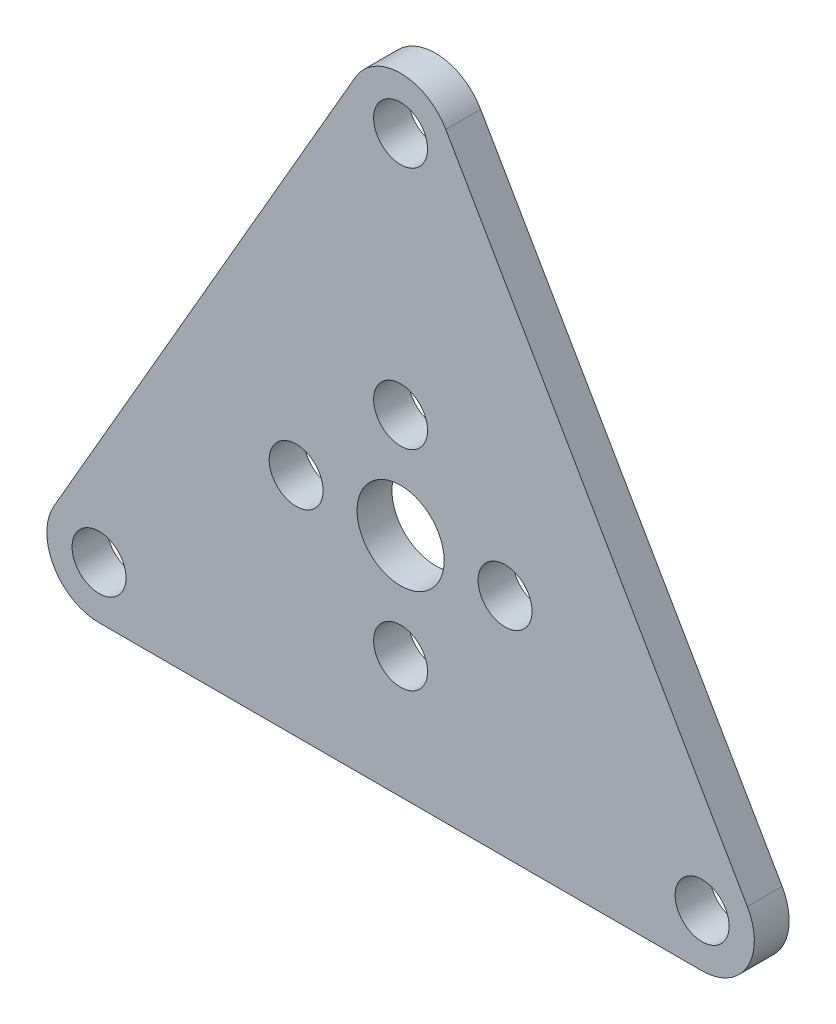
ISO-10303-21;
HEADER;
FILE_DESCRIPTION(('STEP AP214'),'2;1');
FILE_NAME('part.step','',(''),(''),'','','');
FILE_SCHEMA(('AUTOMOTIVE_DESIGN { 1 0 10303 214 1 1 1 1 }'));
ENDSEC;
DATA;
#1=APPLICATION_CONTEXT('core data for automotive mechanical design processes');
#2=APPLICATION_PROTOCOL_DEFINITION('international standard','automotive_design',2000,#1);
#3=PRODUCT_CONTEXT('',#1,'mechanical');
#4=PRODUCT('Part','Part','',(#3));
#5=PRODUCT_RELATED_PRODUCT_CATEGORY('part','',(#4));
#6=PRODUCT_DEFINITION_FORMATION('','',#4);
#7=PRODUCT_DEFINITION_CONTEXT('part definition',#1,'design');
#8=PRODUCT_DEFINITION('design','',#6,#7);
#9=PRODUCT_DEFINITION_SHAPE('','',#8);
#10=(LENGTH_UNIT() NAMED_UNIT(*) SI_UNIT(.MILLI.,.METRE.));
#11=(NAMED_UNIT(*) PLANE_ANGLE_UNIT() SI_UNIT($,.RADIAN.));
#12=(NAMED_UNIT(*) SI_UNIT($,.STERADIAN.) SOLID_ANGLE_UNIT());
#13=UNCERTAINTY_MEASURE_WITH_UNIT(LENGTH_MEASURE(1.E-05),#10,'distance_accuracy_value','');
#14=(GEOMETRIC_REPRESENTATION_CONTEXT(3) GLOBAL_UNCERTAINTY_ASSIGNED_CONTEXT((#13)) GLOBAL_UNIT_ASSIGNED_CONTEXT((#10,
#11,#12)) REPRESENTATION_CONTEXT('',''));
#15=CARTESIAN_POINT('',(0.,0.,0.));
#16=DIRECTION('',(0.,0.,1.));
#17=DIRECTION('',(1.,0.,0.));
#18=AXIS2_PLACEMENT_3D('',#15,#16,#17);
#19=CARTESIAN_POINT('',(-17.3205080756914,-9.99999999999542,2.));
#20=DIRECTION('',(0.,0.,1.));
#21=DIRECTION('',(1.,0.,0.));
#22=AXIS2_PLACEMENT_3D('',#19,#20,#21);
#23=PLANE('',#22);
#24=CARTESIAN_POINT('',(0.,0.,2.));
#25=DIRECTION('',(0.,0.,1.));
#26=DIRECTION('',(1.,0.,0.));
#27=AXIS2_PLACEMENT_3D('',#24,#25,#26);
#28=CIRCLE('',#27,2.5);
#29=CARTESIAN_POINT('',(2.5,0.,2.));
#30=VERTEX_POINT('',#29);
#31=EDGE_CURVE('E239',#30,#30,#28,.T.);
#32=ORIENTED_EDGE('',*,*,#31,.F.);
#33=EDGE_LOOP('',(#32));
#34=FACE_BOUND('',#33,.T.);
#35=CARTESIAN_POINT('',(0.,6.,2.));
#36=DIRECTION('',(0.,0.,1.));
#37=DIRECTION('',(1.,0.,0.));
#38=AXIS2_PLACEMENT_3D('',#35,#36,#37);
#39=CIRCLE('',#38,1.55);
#40=CARTESIAN_POINT('',(1.55,6.,2.));
#41=VERTEX_POINT('',#40);
#42=EDGE_CURVE('E144',#41,#41,#39,.T.);
#43=ORIENTED_EDGE('',*,*,#42,.F.);
#44=EDGE_LOOP('',(#43));
#45=FACE_BOUND('',#44,.T.);
#46=CARTESIAN_POINT('',(6.,0.,2.));
#47=DIRECTION('',(0.,0.,1.));
#48=DIRECTION('',(1.,0.,0.));
#49=AXIS2_PLACEMENT_3D('',#46,#47,#48);
#50=CIRCLE('',#49,1.55);
#51=CARTESIAN_POINT('',(7.55,0.,2.));
#52=VERTEX_POINT('',#51);
#53=EDGE_CURVE('E249',#52,#52,#50,.T.);
#54=ORIENTED_EDGE('',*,*,#53,.F.);
#55=EDGE_LOOP('',(#54));
#56=FACE_BOUND('',#55,.T.);
#57=CARTESIAN_POINT('',(0.,-6.,2.));
#58=DIRECTION('',(0.,0.,1.));
#59=DIRECTION('',(1.,0.,0.));
#60=AXIS2_PLACEMENT_3D('',#57,#58,#59);
#61=CIRCLE('',#60,1.55);
#62=CARTESIAN_POINT('',(1.55,-6.,2.));
#63=VERTEX_POINT('',#62);
#64=EDGE_CURVE('E244',#63,#63,#61,.T.);
#65=ORIENTED_EDGE('',*,*,#64,.F.);
#66=EDGE_LOOP('',(#65));
#67=FACE_BOUND('',#66,.T.);
#68=CARTESIAN_POINT('',(-6.,0.,2.));
#69=DIRECTION('',(0.,0.,1.));
#70=DIRECTION('',(1.,0.,0.));
#71=AXIS2_PLACEMENT_3D('',#68,#69,#70);
#72=CIRCLE('',#71,1.55);
#73=CARTESIAN_POINT('',(-4.45,0.,2.));
#74=VERTEX_POINT('',#73);
#75=EDGE_CURVE('E242',#74,#74,#72,.T.);
#76=ORIENTED_EDGE('',*,*,#75,.F.);
#77=EDGE_LOOP('',(#76));
#78=FACE_BOUND('',#77,.T.);
#79=CARTESIAN_POINT('',(17.3205080756874,-10.0000000000023,2.));
#80=DIRECTION('',(0.,0.,1.));
#81=DIRECTION('',(1.,0.,0.));
#82=AXIS2_PLACEMENT_3D('',#79,#80,#81);
#83=CIRCLE('',#82,1.55);
#84=CARTESIAN_POINT('',(18.8705080756874,-10.0000000000023,2.));
#85=VERTEX_POINT('',#84);
#86=EDGE_CURVE('E164',#85,#85,#83,.T.);
#87=ORIENTED_EDGE('',*,*,#86,.F.);
#88=EDGE_LOOP('',(#87));
#89=FACE_BOUND('',#88,.T.);
#90=CARTESIAN_POINT('',(-17.3205080756914,-9.99999999999542,2.));
#91=DIRECTION('',(0.,0.,1.));
#92=DIRECTION('',(1.,0.,0.));
#93=AXIS2_PLACEMENT_3D('',#90,#91,#92);
#94=CIRCLE('',#93,3.);
#95=CARTESIAN_POINT('',(-19.9185842870445,-8.49999999999508,2.));
#96=VERTEX_POINT('',#95);
#97=CARTESIAN_POINT('',(-17.3205080756914,-12.9999999999954,2.));
#98=VERTEX_POINT('',#97);
#99=EDGE_CURVE('E134',#96,#98,#94,.T.);
#100=ORIENTED_EDGE('',*,*,#99,.T.);
#101=DIRECTION('',(1.,-1.98105218420136E-13,0.));
#102=VECTOR('',#101,1.);
#103=CARTESIAN_POINT('',(-17.3205080756914,-12.9999999999954,2.));
#104=LINE('',#103,#102);
#105=CARTESIAN_POINT('',(17.3205080756869,-13.0000000000023,2.));
#106=VERTEX_POINT('',#105);
#107=EDGE_CURVE('E92',#98,#106,#104,.T.);
#108=ORIENTED_EDGE('',*,*,#107,.T.);
#109=CARTESIAN_POINT('',(17.3205080756874,-10.0000000000023,2.));
#110=DIRECTION('',(0.,0.,1.));
#111=DIRECTION('',(1.,0.,0.));
#112=AXIS2_PLACEMENT_3D('',#109,#110,#111);
#113=CIRCLE('',#112,3.);
#114=CARTESIAN_POINT('',(19.9185842870409,-8.50000000000246,2.));
#115=VERTEX_POINT('',#114);
#116=EDGE_CURVE('E105',#106,#115,#113,.T.);
#117=ORIENTED_EDGE('',*,*,#116,.T.);
#118=DIRECTION('',(-0.499999999999943,0.866025403784472,0.));
#119=VECTOR('',#118,1.);
#120=CARTESIAN_POINT('',(2.59807621135341,21.4999999999998,2.));
#121=LINE('',#120,#119);
#122=CARTESIAN_POINT('',(2.59807621135341,21.4999999999998,2.));
#123=VERTEX_POINT('',#122);
#124=EDGE_CURVE('E99',#115,#123,#121,.T.);
#125=ORIENTED_EDGE('',*,*,#124,.T.);
#126=CARTESIAN_POINT('',(0.,20.,2.));
#127=DIRECTION('',(0.,0.,1.));
#128=DIRECTION('',(1.,0.,0.));
#129=AXIS2_PLACEMENT_3D('',#126,#127,#128);
#130=CIRCLE('',#129,3.);
#131=CARTESIAN_POINT('',(-2.59807621135312,21.5000000000003,2.));
#132=VERTEX_POINT('',#131);
#133=EDGE_CURVE('E103',#123,#132,#130,.T.);
#134=ORIENTED_EDGE('',*,*,#133,.T.);
#135=DIRECTION('',(-0.500000000000114,-0.866025403784372,0.));
#136=VECTOR('',#135,1.);
#137=CARTESIAN_POINT('',(-2.59807621135312,21.5000000000003,2.));
#138=LINE('',#137,#136);
#139=EDGE_CURVE('E55',#132,#96,#138,.T.);
#140=ORIENTED_EDGE('',*,*,#139,.T.);
#141=EDGE_LOOP('',(#100,#108,#117,#125,#134,#140));
#142=FACE_BOUND('',#141,.T.);
#143=CARTESIAN_POINT('',(0.,20.,2.));
#144=DIRECTION('',(0.,0.,1.));
#145=DIRECTION('',(1.,0.,0.));
#146=AXIS2_PLACEMENT_3D('',#143,#144,#145);
#147=CIRCLE('',#146,1.55);
#148=CARTESIAN_POINT('',(1.55,20.,2.));
#149=VERTEX_POINT('',#148);
#150=EDGE_CURVE('E127',#149,#149,#147,.T.);
#151=ORIENTED_EDGE('',*,*,#150,.F.);
#152=EDGE_LOOP('',(#151));
#153=FACE_BOUND('',#152,.T.);
#154=CARTESIAN_POINT('',(-17.3205080756914,-9.99999999999542,2.));
#155=DIRECTION('',(0.,0.,1.));
#156=DIRECTION('',(1.,0.,0.));
#157=AXIS2_PLACEMENT_3D('',#154,#155,#156);
#158=CIRCLE('',#157,1.55);
#159=CARTESIAN_POINT('',(-15.7705080756914,-9.99999999999542,2.));
#160=VERTEX_POINT('',#159);
#161=EDGE_CURVE('E155',#160,#160,#158,.T.);
#162=ORIENTED_EDGE('',*,*,#161,.F.);
#163=EDGE_LOOP('',(#162));
#164=FACE_BOUND('',#163,.T.);
#165=ADVANCED_FACE('F36',(#34,#45,#56,#67,#78,#89,#142,#153,#164),#23,.T.);
#166=CARTESIAN_POINT('',(-17.3205080756914,-9.99999999999542,0.));
#167=DIRECTION('',(0.,0.,1.));
#168=DIRECTION('',(1.,0.,0.));
#169=AXIS2_PLACEMENT_3D('',#166,#167,#168);
#170=PLANE('',#169);
#171=CARTESIAN_POINT('',(0.,0.,0.));
#172=DIRECTION('',(0.,0.,1.));
#173=DIRECTION('',(1.,0.,0.));
#174=AXIS2_PLACEMENT_3D('',#171,#172,#173);
#175=CIRCLE('',#174,2.5);
#176=CARTESIAN_POINT('',(2.5,0.,0.));
#177=VERTEX_POINT('',#176);
#178=EDGE_CURVE('E40',#177,#177,#175,.T.);
#179=ORIENTED_EDGE('',*,*,#178,.T.);
#180=EDGE_LOOP('',(#179));
#181=FACE_BOUND('',#180,.T.);
#182=CARTESIAN_POINT('',(0.,6.,0.));
#183=DIRECTION('',(0.,0.,1.));
#184=DIRECTION('',(1.,0.,0.));
#185=AXIS2_PLACEMENT_3D('',#182,#183,#184);
#186=CIRCLE('',#185,1.55);
#187=CARTESIAN_POINT('',(1.55,6.,0.));
#188=VERTEX_POINT('',#187);
#189=EDGE_CURVE('E149',#188,#188,#186,.T.);
#190=ORIENTED_EDGE('',*,*,#189,.T.);
#191=EDGE_LOOP('',(#190));
#192=FACE_BOUND('',#191,.T.);
#193=CARTESIAN_POINT('',(6.,0.,0.));
#194=DIRECTION('',(0.,0.,1.));
#195=DIRECTION('',(1.,0.,0.));
#196=AXIS2_PLACEMENT_3D('',#193,#194,#195);
#197=CIRCLE('',#196,1.55);
#198=CARTESIAN_POINT('',(7.55,0.,0.));
#199=VERTEX_POINT('',#198);
#200=EDGE_CURVE('E147',#199,#199,#197,.T.);
#201=ORIENTED_EDGE('',*,*,#200,.T.);
#202=EDGE_LOOP('',(#201));
#203=FACE_BOUND('',#202,.T.);
#204=CARTESIAN_POINT('',(0.,-6.,0.));
#205=DIRECTION('',(0.,0.,1.));
#206=DIRECTION('',(1.,0.,0.));
#207=AXIS2_PLACEMENT_3D('',#204,#205,#206);
#208=CIRCLE('',#207,1.55);
#209=CARTESIAN_POINT('',(1.55,-6.,0.));
#210=VERTEX_POINT('',#209);
#211=EDGE_CURVE('E143',#210,#210,#208,.T.);
#212=ORIENTED_EDGE('',*,*,#211,.T.);
#213=EDGE_LOOP('',(#212));
#214=FACE_BOUND('',#213,.T.);
#215=CARTESIAN_POINT('',(-6.,0.,0.));
#216=DIRECTION('',(0.,0.,1.));
#217=DIRECTION('',(1.,0.,0.));
#218=AXIS2_PLACEMENT_3D('',#215,#216,#217);
#219=CIRCLE('',#218,1.55);
#220=CARTESIAN_POINT('',(-4.45,0.,0.));
#221=VERTEX_POINT('',#220);
#222=EDGE_CURVE('E140',#221,#221,#219,.T.);
#223=ORIENTED_EDGE('',*,*,#222,.T.);
#224=EDGE_LOOP('',(#223));
#225=FACE_BOUND('',#224,.T.);
#226=CARTESIAN_POINT('',(-17.3205080756914,-9.99999999999542,0.));
#227=DIRECTION('',(0.,0.,1.));
#228=DIRECTION('',(1.,0.,0.));
#229=AXIS2_PLACEMENT_3D('',#226,#227,#228);
#230=CIRCLE('',#229,3.);
#231=CARTESIAN_POINT('',(-19.9185842870445,-8.49999999999508,0.));
#232=VERTEX_POINT('',#231);
#233=CARTESIAN_POINT('',(-17.3205080756914,-12.9999999999954,0.));
#234=VERTEX_POINT('',#233);
#235=EDGE_CURVE('E123',#232,#234,#230,.T.);
#236=ORIENTED_EDGE('',*,*,#235,.F.);
#237=DIRECTION('',(-0.500000000000114,-0.866025403784372,0.));
#238=VECTOR('',#237,1.);
#239=CARTESIAN_POINT('',(-2.59807621135312,21.5000000000003,0.));
#240=LINE('',#239,#238);
#241=CARTESIAN_POINT('',(-2.59807621135312,21.5000000000003,0.));
#242=VERTEX_POINT('',#241);
#243=EDGE_CURVE('E84',#242,#232,#240,.T.);
#244=ORIENTED_EDGE('',*,*,#243,.F.);
#245=CARTESIAN_POINT('',(0.,20.,0.));
#246=DIRECTION('',(0.,0.,1.));
#247=DIRECTION('',(1.,0.,0.));
#248=AXIS2_PLACEMENT_3D('',#245,#246,#247);
#249=CIRCLE('',#248,3.);
#250=CARTESIAN_POINT('',(2.59807621135341,21.4999999999998,0.));
#251=VERTEX_POINT('',#250);
#252=EDGE_CURVE('E78',#251,#242,#249,.T.);
#253=ORIENTED_EDGE('',*,*,#252,.F.);
#254=DIRECTION('',(-0.499999999999943,0.866025403784472,0.));
#255=VECTOR('',#254,1.);
#256=CARTESIAN_POINT('',(2.59807621135341,21.4999999999998,0.));
#257=LINE('',#256,#255);
#258=CARTESIAN_POINT('',(19.9185842870409,-8.50000000000246,0.));
#259=VERTEX_POINT('',#258);
#260=EDGE_CURVE('E113',#259,#251,#257,.T.);
#261=ORIENTED_EDGE('',*,*,#260,.F.);
#262=CARTESIAN_POINT('',(17.3205080756874,-10.0000000000023,0.));
#263=DIRECTION('',(0.,0.,1.));
#264=DIRECTION('',(1.,0.,0.));
#265=AXIS2_PLACEMENT_3D('',#262,#263,#264);
#266=CIRCLE('',#265,3.);
#267=CARTESIAN_POINT('',(17.3205080756869,-13.0000000000023,0.));
#268=VERTEX_POINT('',#267);
#269=EDGE_CURVE('E129',#268,#259,#266,.T.);
#270=ORIENTED_EDGE('',*,*,#269,.F.);
#271=DIRECTION('',(1.,-1.98105218420136E-13,0.));
#272=VECTOR('',#271,1.);
#273=CARTESIAN_POINT('',(-17.3205080756914,-12.9999999999954,0.));
#274=LINE('',#273,#272);
#275=EDGE_CURVE('E126',#234,#268,#274,.T.);
#276=ORIENTED_EDGE('',*,*,#275,.F.);
#277=EDGE_LOOP('',(#236,#244,#253,#261,#270,#276));
#278=FACE_BOUND('',#277,.T.);
#279=CARTESIAN_POINT('',(0.,20.,0.));
#280=DIRECTION('',(0.,0.,1.));
#281=DIRECTION('',(1.,0.,0.));
#282=AXIS2_PLACEMENT_3D('',#279,#280,#281);
#283=CIRCLE('',#282,1.55);
#284=CARTESIAN_POINT('',(1.55,20.,0.));
#285=VERTEX_POINT('',#284);
#286=EDGE_CURVE('E167',#285,#285,#283,.T.);
#287=ORIENTED_EDGE('',*,*,#286,.T.);
#288=EDGE_LOOP('',(#287));
#289=FACE_BOUND('',#288,.T.);
#290=CARTESIAN_POINT('',(17.3205080756874,-10.0000000000023,0.));
#291=DIRECTION('',(0.,0.,1.));
#292=DIRECTION('',(1.,0.,0.));
#293=AXIS2_PLACEMENT_3D('',#290,#291,#292);
#294=CIRCLE('',#293,1.55);
#295=CARTESIAN_POINT('',(18.8705080756874,-10.0000000000023,0.));
#296=VERTEX_POINT('',#295);
#297=EDGE_CURVE('E160',#296,#296,#294,.T.);
#298=ORIENTED_EDGE('',*,*,#297,.T.);
#299=EDGE_LOOP('',(#298));
#300=FACE_BOUND('',#299,.T.);
#301=CARTESIAN_POINT('',(-17.3205080756914,-9.99999999999542,0.));
#302=DIRECTION('',(0.,0.,1.));
#303=DIRECTION('',(1.,0.,0.));
#304=AXIS2_PLACEMENT_3D('',#301,#302,#303);
#305=CIRCLE('',#304,1.55);
#306=CARTESIAN_POINT('',(-15.7705080756914,-9.99999999999542,0.));
#307=VERTEX_POINT('',#306);
#308=EDGE_CURVE('E151',#307,#307,#305,.T.);
#309=ORIENTED_EDGE('',*,*,#308,.T.);
#310=EDGE_LOOP('',(#309));
#311=FACE_BOUND('',#310,.T.);
#312=ADVANCED_FACE('F183',(#181,#192,#203,#214,#225,#278,#289,#300,#311),#170,.F.);
#313=CARTESIAN_POINT('',(-17.3205080756914,-9.99999999999542,2.));
#314=DIRECTION('',(0.,0.,-1.));
#315=DIRECTION('',(-1.,0.,0.));
#316=AXIS2_PLACEMENT_3D('',#313,#314,#315);
#317=CYLINDRICAL_SURFACE('',#316,3.);
#318=ORIENTED_EDGE('',*,*,#235,.T.);
#319=DIRECTION('',(0.,0.,-1.));
#320=VECTOR('',#319,1.);
#321=CARTESIAN_POINT('',(-17.3205080756914,-12.9999999999954,2.));
#322=LINE('',#321,#320);
#323=EDGE_CURVE('E11',#98,#234,#322,.T.);
#324=ORIENTED_EDGE('',*,*,#323,.F.);
#325=ORIENTED_EDGE('',*,*,#99,.F.);
#326=DIRECTION('',(0.,0.,-1.));
#327=VECTOR('',#326,1.);
#328=CARTESIAN_POINT('',(-19.9185842870445,-8.49999999999508,2.));
#329=LINE('',#328,#327);
#330=EDGE_CURVE('E119',#96,#232,#329,.T.);
#331=ORIENTED_EDGE('',*,*,#330,.T.);
#332=EDGE_LOOP('',(#318,#324,#325,#331));
#333=FACE_BOUND('',#332,.T.);
#334=ADVANCED_FACE('F38',(#333),#317,.T.);
#335=CARTESIAN_POINT('',(-17.3205080756914,-12.9999999999954,2.));
#336=DIRECTION('',(1.98105218420136E-13,1.,0.));
#337=DIRECTION('',(-1.,1.98105218420136E-13,0.));
#338=AXIS2_PLACEMENT_3D('',#335,#336,#337);
#339=PLANE('',#338);
#340=ORIENTED_EDGE('',*,*,#275,.T.);
#341=DIRECTION('',(0.,0.,-1.));
#342=VECTOR('',#341,1.);
#343=CARTESIAN_POINT('',(17.3205080756869,-13.0000000000023,2.));
#344=LINE('',#343,#342);
#345=EDGE_CURVE('E46',#106,#268,#344,.T.);
#346=ORIENTED_EDGE('',*,*,#345,.F.);
#347=ORIENTED_EDGE('',*,*,#107,.F.);
#348=ORIENTED_EDGE('',*,*,#323,.T.);
#349=EDGE_LOOP('',(#340,#346,#347,#348));
#350=FACE_BOUND('',#349,.T.);
#351=ADVANCED_FACE('F177',(#350),#339,.F.);
#352=CARTESIAN_POINT('',(17.3205080756874,-10.0000000000023,2.));
#353=DIRECTION('',(0.,0.,-1.));
#354=DIRECTION('',(-1.,0.,0.));
#355=AXIS2_PLACEMENT_3D('',#352,#353,#354);
#356=CYLINDRICAL_SURFACE('',#355,3.);
#357=ORIENTED_EDGE('',*,*,#269,.T.);
#358=DIRECTION('',(0.,0.,-1.));
#359=VECTOR('',#358,1.);
#360=CARTESIAN_POINT('',(19.9185842870409,-8.50000000000246,2.));
#361=LINE('',#360,#359);
#362=EDGE_CURVE('E114',#115,#259,#361,.T.);
#363=ORIENTED_EDGE('',*,*,#362,.F.);
#364=ORIENTED_EDGE('',*,*,#116,.F.);
#365=ORIENTED_EDGE('',*,*,#345,.T.);
#366=EDGE_LOOP('',(#357,#363,#364,#365));
#367=FACE_BOUND('',#366,.T.);
#368=ADVANCED_FACE('F180',(#367),#356,.T.);
#369=CARTESIAN_POINT('',(2.59807621135341,21.4999999999998,2.));
#370=DIRECTION('',(-0.866025403784472,-0.499999999999943,0.));
#371=DIRECTION('',(0.499999999999943,-0.866025403784472,0.));
#372=AXIS2_PLACEMENT_3D('',#369,#370,#371);
#373=PLANE('',#372);
#374=ORIENTED_EDGE('',*,*,#260,.T.);
#375=DIRECTION('',(0.,0.,-1.));
#376=VECTOR('',#375,1.);
#377=CARTESIAN_POINT('',(2.59807621135341,21.4999999999998,2.));
#378=LINE('',#377,#376);
#379=EDGE_CURVE('E110',#123,#251,#378,.T.);
#380=ORIENTED_EDGE('',*,*,#379,.F.);
#381=ORIENTED_EDGE('',*,*,#124,.F.);
#382=ORIENTED_EDGE('',*,*,#362,.T.);
#383=EDGE_LOOP('',(#374,#380,#381,#382));
#384=FACE_BOUND('',#383,.T.);
#385=ADVANCED_FACE('F111',(#384),#373,.F.);
#386=CARTESIAN_POINT('',(0.,20.,2.));
#387=DIRECTION('',(0.,0.,-1.));
#388=DIRECTION('',(-1.,0.,0.));
#389=AXIS2_PLACEMENT_3D('',#386,#387,#388);
#390=CYLINDRICAL_SURFACE('',#389,3.);
#391=ORIENTED_EDGE('',*,*,#252,.T.);
#392=DIRECTION('',(0.,0.,-1.));
#393=VECTOR('',#392,1.);
#394=CARTESIAN_POINT('',(-2.59807621135312,21.5000000000003,2.));
#395=LINE('',#394,#393);
#396=EDGE_CURVE('E115',#132,#242,#395,.T.);
#397=ORIENTED_EDGE('',*,*,#396,.F.);
#398=ORIENTED_EDGE('',*,*,#133,.F.);
#399=ORIENTED_EDGE('',*,*,#379,.T.);
#400=EDGE_LOOP('',(#391,#397,#398,#399));
#401=FACE_BOUND('',#400,.T.);
#402=ADVANCED_FACE('F117',(#401),#390,.T.);
#403=CARTESIAN_POINT('',(-2.59807621135312,21.5000000000003,2.));
#404=DIRECTION('',(0.866025403784373,-0.500000000000114,0.));
#405=DIRECTION('',(0.500000000000114,0.866025403784373,0.));
#406=AXIS2_PLACEMENT_3D('',#403,#404,#405);
#407=PLANE('',#406);
#408=ORIENTED_EDGE('',*,*,#243,.T.);
#409=ORIENTED_EDGE('',*,*,#330,.F.);
#410=ORIENTED_EDGE('',*,*,#139,.F.);
#411=ORIENTED_EDGE('',*,*,#396,.T.);
#412=EDGE_LOOP('',(#408,#409,#410,#411));
#413=FACE_BOUND('',#412,.T.);
#414=ADVANCED_FACE('F186',(#413),#407,.F.);
#415=CARTESIAN_POINT('',(0.,20.,2.));
#416=DIRECTION('',(0.,0.,-1.));
#417=DIRECTION('',(-1.,0.,0.));
#418=AXIS2_PLACEMENT_3D('',#415,#416,#417);
#419=CYLINDRICAL_SURFACE('',#418,1.55);
#420=ORIENTED_EDGE('',*,*,#150,.T.);
#421=EDGE_LOOP('',(#420));
#422=FACE_BOUND('',#421,.T.);
#423=ORIENTED_EDGE('',*,*,#286,.F.);
#424=EDGE_LOOP('',(#423));
#425=FACE_BOUND('',#424,.T.);
#426=ADVANCED_FACE('F188',(#422,#425),#419,.F.);
#427=CARTESIAN_POINT('',(17.3205080756874,-10.0000000000023,2.));
#428=DIRECTION('',(0.,0.,-1.));
#429=DIRECTION('',(-1.,0.,0.));
#430=AXIS2_PLACEMENT_3D('',#427,#428,#429);
#431=CYLINDRICAL_SURFACE('',#430,1.55);
#432=ORIENTED_EDGE('',*,*,#86,.T.);
#433=EDGE_LOOP('',(#432));
#434=FACE_BOUND('',#433,.T.);
#435=ORIENTED_EDGE('',*,*,#297,.F.);
#436=EDGE_LOOP('',(#435));
#437=FACE_BOUND('',#436,.T.);
#438=ADVANCED_FACE('F194',(#434,#437),#431,.F.);
#439=CARTESIAN_POINT('',(-17.3205080756914,-9.99999999999542,2.));
#440=DIRECTION('',(0.,0.,-1.));
#441=DIRECTION('',(-1.,0.,0.));
#442=AXIS2_PLACEMENT_3D('',#439,#440,#441);
#443=CYLINDRICAL_SURFACE('',#442,1.55);
#444=ORIENTED_EDGE('',*,*,#161,.T.);
#445=EDGE_LOOP('',(#444));
#446=FACE_BOUND('',#445,.T.);
#447=ORIENTED_EDGE('',*,*,#308,.F.);
#448=EDGE_LOOP('',(#447));
#449=FACE_BOUND('',#448,.T.);
#450=ADVANCED_FACE('F211',(#446,#449),#443,.F.);
#451=CARTESIAN_POINT('',(-6.,0.,-1.));
#452=DIRECTION('',(0.,0.,1.));
#453=DIRECTION('',(1.,0.,0.));
#454=AXIS2_PLACEMENT_3D('',#451,#452,#453);
#455=CYLINDRICAL_SURFACE('',#454,1.55);
#456=ORIENTED_EDGE('',*,*,#75,.T.);
#457=EDGE_LOOP('',(#456));
#458=FACE_BOUND('',#457,.T.);
#459=ORIENTED_EDGE('',*,*,#222,.F.);
#460=EDGE_LOOP('',(#459));
#461=FACE_BOUND('',#460,.T.);
#462=ADVANCED_FACE('F215',(#458,#461),#455,.F.);
#463=CARTESIAN_POINT('',(0.,-6.,-1.));
#464=DIRECTION('',(0.,0.,1.));
#465=DIRECTION('',(1.,0.,0.));
#466=AXIS2_PLACEMENT_3D('',#463,#464,#465);
#467=CYLINDRICAL_SURFACE('',#466,1.55);
#468=ORIENTED_EDGE('',*,*,#64,.T.);
#469=EDGE_LOOP('',(#468));
#470=FACE_BOUND('',#469,.T.);
#471=ORIENTED_EDGE('',*,*,#211,.F.);
#472=EDGE_LOOP('',(#471));
#473=FACE_BOUND('',#472,.T.);
#474=ADVANCED_FACE('F219',(#470,#473),#467,.F.);
#475=CARTESIAN_POINT('',(6.,0.,-1.));
#476=DIRECTION('',(0.,0.,1.));
#477=DIRECTION('',(1.,0.,0.));
#478=AXIS2_PLACEMENT_3D('',#475,#476,#477);
#479=CYLINDRICAL_SURFACE('',#478,1.55);
#480=ORIENTED_EDGE('',*,*,#53,.T.);
#481=EDGE_LOOP('',(#480));
#482=FACE_BOUND('',#481,.T.);
#483=ORIENTED_EDGE('',*,*,#200,.F.);
#484=EDGE_LOOP('',(#483));
#485=FACE_BOUND('',#484,.T.);
#486=ADVANCED_FACE('F223',(#482,#485),#479,.F.);
#487=CARTESIAN_POINT('',(0.,6.,-1.));
#488=DIRECTION('',(0.,0.,1.));
#489=DIRECTION('',(1.,0.,0.));
#490=AXIS2_PLACEMENT_3D('',#487,#488,#489);
#491=CYLINDRICAL_SURFACE('',#490,1.55);
#492=ORIENTED_EDGE('',*,*,#42,.T.);
#493=EDGE_LOOP('',(#492));
#494=FACE_BOUND('',#493,.T.);
#495=ORIENTED_EDGE('',*,*,#189,.F.);
#496=EDGE_LOOP('',(#495));
#497=FACE_BOUND('',#496,.T.);
#498=ADVANCED_FACE('F227',(#494,#497),#491,.F.);
#499=CARTESIAN_POINT('',(0.,0.,-1.));
#500=DIRECTION('',(0.,0.,1.));
#501=DIRECTION('',(1.,0.,0.));
#502=AXIS2_PLACEMENT_3D('',#499,#500,#501);
#503=CYLINDRICAL_SURFACE('',#502,2.5);
#504=ORIENTED_EDGE('',*,*,#31,.T.);
#505=EDGE_LOOP('',(#504));
#506=FACE_BOUND('',#505,.T.);
#507=ORIENTED_EDGE('',*,*,#178,.F.);
#508=EDGE_LOOP('',(#507));
#509=FACE_BOUND('',#508,.T.);
#510=ADVANCED_FACE('F231',(#506,#509),#503,.F.);
#511=CLOSED_SHELL('',(#165,#312,#334,#351,#368,#385,#402,#414,#426,#438,#450,#462,#474,#486,
#498,#510));
#512=MANIFOLD_SOLID_BREP('B2',#511);
#513=ADVANCED_BREP_SHAPE_REPRESENTATION('',(#18,#512),#14);
#514=SHAPE_DEFINITION_REPRESENTATION(#9,#513);
ENDSEC;
END-ISO-10303-21;
